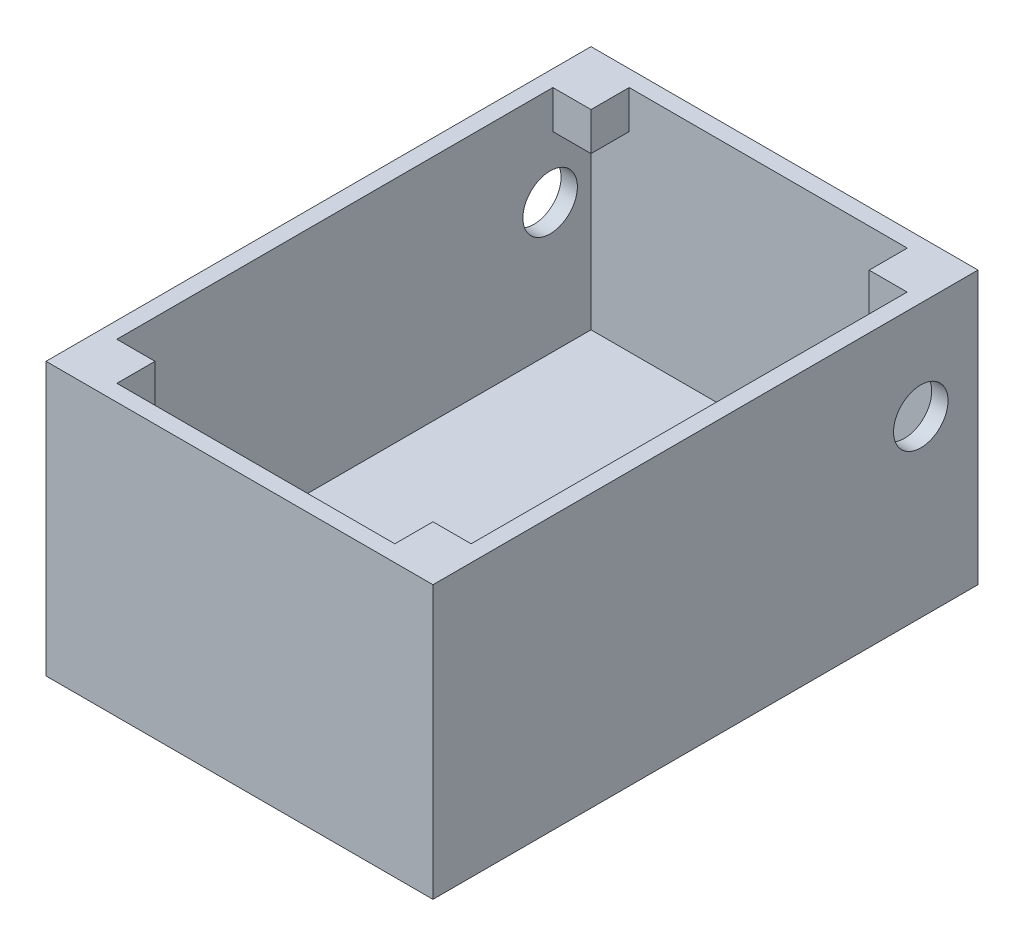
ISO-10303-21;
HEADER;
FILE_DESCRIPTION(('STEP AP214'),'2;1');
FILE_NAME('part.step','',(''),(''),'','','');
FILE_SCHEMA(('AUTOMOTIVE_DESIGN { 1 0 10303 214 1 1 1 1 }'));
ENDSEC;
DATA;
#1=APPLICATION_CONTEXT('core data for automotive mechanical design processes');
#2=APPLICATION_PROTOCOL_DEFINITION('international standard','automotive_design',2000,#1);
#3=PRODUCT_CONTEXT('',#1,'mechanical');
#4=PRODUCT('Part','Part','',(#3));
#5=PRODUCT_RELATED_PRODUCT_CATEGORY('part','',(#4));
#6=PRODUCT_DEFINITION_FORMATION('','',#4);
#7=PRODUCT_DEFINITION_CONTEXT('part definition',#1,'design');
#8=PRODUCT_DEFINITION('design','',#6,#7);
#9=PRODUCT_DEFINITION_SHAPE('','',#8);
#10=(LENGTH_UNIT() NAMED_UNIT(*) SI_UNIT(.MILLI.,.METRE.));
#11=(NAMED_UNIT(*) PLANE_ANGLE_UNIT() SI_UNIT($,.RADIAN.));
#12=(NAMED_UNIT(*) SI_UNIT($,.STERADIAN.) SOLID_ANGLE_UNIT());
#13=UNCERTAINTY_MEASURE_WITH_UNIT(LENGTH_MEASURE(1.E-05),#10,'distance_accuracy_value','');
#14=(GEOMETRIC_REPRESENTATION_CONTEXT(3) GLOBAL_UNCERTAINTY_ASSIGNED_CONTEXT((#13)) GLOBAL_UNIT_ASSIGNED_CONTEXT((#10,
#11,#12)) REPRESENTATION_CONTEXT('',''));
#15=CARTESIAN_POINT('',(0.,0.,0.));
#16=DIRECTION('',(0.,0.,1.));
#17=DIRECTION('',(1.,0.,0.));
#18=AXIS2_PLACEMENT_3D('',#15,#16,#17);
#19=CARTESIAN_POINT('',(-61.6961689538245,3.,-26.5));
#20=DIRECTION('',(-1.,0.,0.));
#21=DIRECTION('',(0.,0.,1.));
#22=AXIS2_PLACEMENT_3D('',#19,#20,#21);
#23=PLANE('',#22);
#24=CARTESIAN_POINT('',(-61.6961689538245,32.,-19.));
#25=DIRECTION('',(-1.,0.,0.));
#26=DIRECTION('',(0.,0.,1.));
#27=AXIS2_PLACEMENT_3D('',#24,#25,#26);
#28=CIRCLE('',#27,5.);
#29=CARTESIAN_POINT('',(-61.6961689538245,32.,-14.));
#30=VERTEX_POINT('',#29);
#31=EDGE_CURVE('E275',#30,#30,#28,.T.);
#32=ORIENTED_EDGE('',*,*,#31,.T.);
#33=EDGE_LOOP('',(#32));
#34=FACE_BOUND('',#33,.T.);
#35=DIRECTION('',(0.,0.,1.));
#36=VECTOR('',#35,1.);
#37=CARTESIAN_POINT('',(-61.6961689538245,50.,-26.5));
#38=LINE('',#37,#36);
#39=CARTESIAN_POINT('',(-61.6961689538245,50.,-19.5));
#40=VERTEX_POINT('',#39);
#41=CARTESIAN_POINT('',(-61.6961689538245,50.,60.5));
#42=VERTEX_POINT('',#41);
#43=EDGE_CURVE('E52',#40,#42,#38,.T.);
#44=ORIENTED_EDGE('',*,*,#43,.T.);
#45=DIRECTION('',(0.,-1.,0.));
#46=VECTOR('',#45,1.);
#47=CARTESIAN_POINT('',(-61.6961689538245,3.,60.5));
#48=LINE('',#47,#46);
#49=CARTESIAN_POINT('',(-61.6961689538245,43.,60.5));
#50=VERTEX_POINT('',#49);
#51=EDGE_CURVE('E47',#42,#50,#48,.T.);
#52=ORIENTED_EDGE('',*,*,#51,.T.);
#53=DIRECTION('',(0.,0.,1.));
#54=VECTOR('',#53,1.);
#55=CARTESIAN_POINT('',(-61.6961689538245,43.,-26.5));
#56=LINE('',#55,#54);
#57=CARTESIAN_POINT('',(-61.6961689538245,43.,67.5));
#58=VERTEX_POINT('',#57);
#59=EDGE_CURVE('E202',#50,#58,#56,.T.);
#60=ORIENTED_EDGE('',*,*,#59,.T.);
#61=DIRECTION('',(0.,1.,0.));
#62=VECTOR('',#61,1.);
#63=CARTESIAN_POINT('',(-61.6961689538245,3.,67.5));
#64=LINE('',#63,#62);
#65=CARTESIAN_POINT('',(-61.6961689538245,3.,67.5));
#66=VERTEX_POINT('',#65);
#67=EDGE_CURVE('E322',#66,#58,#64,.T.);
#68=ORIENTED_EDGE('',*,*,#67,.F.);
#69=DIRECTION('',(0.,0.,1.));
#70=VECTOR('',#69,1.);
#71=CARTESIAN_POINT('',(-61.6961689538245,3.,-26.5));
#72=LINE('',#71,#70);
#73=CARTESIAN_POINT('',(-61.6961689538245,3.,35.1620847651777));
#74=VERTEX_POINT('',#73);
#75=EDGE_CURVE('E313',#74,#66,#72,.T.);
#76=ORIENTED_EDGE('',*,*,#75,.F.);
#77=DIRECTION('',(0.,-1.,0.));
#78=VECTOR('',#77,1.);
#79=CARTESIAN_POINT('',(-61.6961689538245,8.,35.1620847651777));
#80=LINE('',#79,#78);
#81=CARTESIAN_POINT('',(-61.6961689538245,8.,35.1620847651777));
#82=VERTEX_POINT('',#81);
#83=EDGE_CURVE('E301',#82,#74,#80,.T.);
#84=ORIENTED_EDGE('',*,*,#83,.F.);
#85=DIRECTION('',(0.,0.,1.));
#86=VECTOR('',#85,1.);
#87=CARTESIAN_POINT('',(-61.6961689538245,8.,-26.5));
#88=LINE('',#87,#86);
#89=CARTESIAN_POINT('',(-61.6961689538245,8.,-26.5));
#90=VERTEX_POINT('',#89);
#91=EDGE_CURVE('E279',#90,#82,#88,.T.);
#92=ORIENTED_EDGE('',*,*,#91,.F.);
#93=DIRECTION('',(0.,1.,0.));
#94=VECTOR('',#93,1.);
#95=CARTESIAN_POINT('',(-61.6961689538245,3.,-26.5));
#96=LINE('',#95,#94);
#97=CARTESIAN_POINT('',(-61.6961689538245,43.,-26.5));
#98=VERTEX_POINT('',#97);
#99=EDGE_CURVE('E326',#90,#98,#96,.T.);
#100=ORIENTED_EDGE('',*,*,#99,.T.);
#101=DIRECTION('',(0.,0.,-1.));
#102=VECTOR('',#101,1.);
#103=CARTESIAN_POINT('',(-61.6961689538245,43.,-26.5));
#104=LINE('',#103,#102);
#105=CARTESIAN_POINT('',(-61.6961689538245,43.,-19.5));
#106=VERTEX_POINT('',#105);
#107=EDGE_CURVE('E265',#106,#98,#104,.T.);
#108=ORIENTED_EDGE('',*,*,#107,.F.);
#109=DIRECTION('',(0.,1.,0.));
#110=VECTOR('',#109,1.);
#111=CARTESIAN_POINT('',(-61.6961689538245,3.,-19.5));
#112=LINE('',#111,#110);
#113=EDGE_CURVE('E258',#106,#40,#112,.T.);
#114=ORIENTED_EDGE('',*,*,#113,.T.);
#115=EDGE_LOOP('',(#44,#52,#60,#68,#76,#84,#92,#100,#108,#114));
#116=FACE_BOUND('',#115,.T.);
#117=ADVANCED_FACE('F32',(#34,#116),#23,.F.);
#118=CARTESIAN_POINT('',(-61.6961689538245,3.,-26.5));
#119=DIRECTION('',(0.,0.,-1.));
#120=DIRECTION('',(-1.,0.,0.));
#121=AXIS2_PLACEMENT_3D('',#118,#119,#120);
#122=PLANE('',#121);
#123=DIRECTION('',(-1.,0.,0.));
#124=VECTOR('',#123,1.);
#125=CARTESIAN_POINT('',(-61.6961689538245,43.,-26.5));
#126=LINE('',#125,#124);
#127=CARTESIAN_POINT('',(3.30383104617551,43.,-26.5));
#128=VERTEX_POINT('',#127);
#129=CARTESIAN_POINT('',(-3.66743388043886,43.,-26.5));
#130=VERTEX_POINT('',#129);
#131=EDGE_CURVE('E241',#128,#130,#126,.T.);
#132=ORIENTED_EDGE('',*,*,#131,.T.);
#133=DIRECTION('',(0.,1.,0.));
#134=VECTOR('',#133,1.);
#135=CARTESIAN_POINT('',(-3.66743388043886,3.,-26.5));
#136=LINE('',#135,#134);
#137=CARTESIAN_POINT('',(-3.66743388043886,50.,-26.5));
#138=VERTEX_POINT('',#137);
#139=EDGE_CURVE('E243',#130,#138,#136,.T.);
#140=ORIENTED_EDGE('',*,*,#139,.T.);
#141=DIRECTION('',(-1.,0.,0.));
#142=VECTOR('',#141,1.);
#143=CARTESIAN_POINT('',(-61.6961689538245,50.,-26.5));
#144=LINE('',#143,#142);
#145=CARTESIAN_POINT('',(-54.6961689538245,50.,-26.5));
#146=VERTEX_POINT('',#145);
#147=EDGE_CURVE('E319',#138,#146,#144,.T.);
#148=ORIENTED_EDGE('',*,*,#147,.T.);
#149=DIRECTION('',(0.,-1.,0.));
#150=VECTOR('',#149,1.);
#151=CARTESIAN_POINT('',(-54.6961689538245,3.,-26.5));
#152=LINE('',#151,#150);
#153=CARTESIAN_POINT('',(-54.6961689538245,43.,-26.5));
#154=VERTEX_POINT('',#153);
#155=EDGE_CURVE('E260',#146,#154,#152,.T.);
#156=ORIENTED_EDGE('',*,*,#155,.T.);
#157=DIRECTION('',(1.,0.,0.));
#158=VECTOR('',#157,1.);
#159=CARTESIAN_POINT('',(-61.6961689538245,43.,-26.5));
#160=LINE('',#159,#158);
#161=EDGE_CURVE('E262',#98,#154,#160,.T.);
#162=ORIENTED_EDGE('',*,*,#161,.F.);
#163=ORIENTED_EDGE('',*,*,#99,.F.);
#164=DIRECTION('',(-1.,0.,0.));
#165=VECTOR('',#164,1.);
#166=CARTESIAN_POINT('',(-61.6961689538245,8.,-26.5));
#167=LINE('',#166,#165);
#168=CARTESIAN_POINT('',(-10.6961689538245,8.,-26.5));
#169=VERTEX_POINT('',#168);
#170=EDGE_CURVE('E288',#169,#90,#167,.T.);
#171=ORIENTED_EDGE('',*,*,#170,.F.);
#172=DIRECTION('',(0.,-1.,0.));
#173=VECTOR('',#172,1.);
#174=CARTESIAN_POINT('',(-10.6961689538245,8.,-26.5));
#175=LINE('',#174,#173);
#176=CARTESIAN_POINT('',(-10.6961689538245,3.,-26.5));
#177=VERTEX_POINT('',#176);
#178=EDGE_CURVE('E291',#169,#177,#175,.T.);
#179=ORIENTED_EDGE('',*,*,#178,.T.);
#180=DIRECTION('',(-1.,0.,0.));
#181=VECTOR('',#180,1.);
#182=CARTESIAN_POINT('',(-61.6961689538245,3.,-26.5));
#183=LINE('',#182,#181);
#184=CARTESIAN_POINT('',(3.30383104617551,3.,-26.5));
#185=VERTEX_POINT('',#184);
#186=EDGE_CURVE('E311',#185,#177,#183,.T.);
#187=ORIENTED_EDGE('',*,*,#186,.F.);
#188=DIRECTION('',(0.,1.,0.));
#189=VECTOR('',#188,1.);
#190=CARTESIAN_POINT('',(3.30383104617551,3.,-26.5));
#191=LINE('',#190,#189);
#192=EDGE_CURVE('E329',#185,#128,#191,.T.);
#193=ORIENTED_EDGE('',*,*,#192,.T.);
#194=EDGE_LOOP('',(#132,#140,#148,#156,#162,#163,#171,#179,#187,#193));
#195=FACE_BOUND('',#194,.T.);
#196=ADVANCED_FACE('F390',(#195),#122,.F.);
#197=CARTESIAN_POINT('',(0.,3.,0.));
#198=DIRECTION('',(0.,-1.,0.));
#199=DIRECTION('',(0.,0.,-1.));
#200=AXIS2_PLACEMENT_3D('',#197,#198,#199);
#201=PLANE('',#200);
#202=DIRECTION('',(1.,0.,0.));
#203=VECTOR('',#202,1.);
#204=CARTESIAN_POINT('',(-61.6961689538245,3.,35.1620847651777));
#205=LINE('',#204,#203);
#206=CARTESIAN_POINT('',(-10.6961689538245,3.,35.1620847651777));
#207=VERTEX_POINT('',#206);
#208=EDGE_CURVE('E278',#74,#207,#205,.T.);
#209=ORIENTED_EDGE('',*,*,#208,.F.);
#210=ORIENTED_EDGE('',*,*,#75,.T.);
#211=DIRECTION('',(1.,0.,0.));
#212=VECTOR('',#211,1.);
#213=CARTESIAN_POINT('',(-61.6961689538245,3.,67.5));
#214=LINE('',#213,#212);
#215=CARTESIAN_POINT('',(3.30383104617551,3.,67.5));
#216=VERTEX_POINT('',#215);
#217=EDGE_CURVE('E305',#66,#216,#214,.T.);
#218=ORIENTED_EDGE('',*,*,#217,.T.);
#219=DIRECTION('',(0.,0.,-1.));
#220=VECTOR('',#219,1.);
#221=CARTESIAN_POINT('',(3.30383104617551,3.,-26.5));
#222=LINE('',#221,#220);
#223=EDGE_CURVE('E308',#216,#185,#222,.T.);
#224=ORIENTED_EDGE('',*,*,#223,.T.);
#225=ORIENTED_EDGE('',*,*,#186,.T.);
#226=DIRECTION('',(0.,0.,-1.));
#227=VECTOR('',#226,1.);
#228=CARTESIAN_POINT('',(-10.6961689538245,3.,-26.5));
#229=LINE('',#228,#227);
#230=EDGE_CURVE('E283',#207,#177,#229,.T.);
#231=ORIENTED_EDGE('',*,*,#230,.F.);
#232=EDGE_LOOP('',(#209,#210,#218,#224,#225,#231));
#233=FACE_BOUND('',#232,.T.);
#234=ADVANCED_FACE('F421',(#233),#201,.F.);
#235=CARTESIAN_POINT('',(-64.6961689538245,50.,-29.5));
#236=DIRECTION('',(0.,0.,-1.));
#237=DIRECTION('',(-1.,0.,0.));
#238=AXIS2_PLACEMENT_3D('',#235,#236,#237);
#239=PLANE('',#238);
#240=DIRECTION('',(1.,0.,0.));
#241=VECTOR('',#240,1.);
#242=CARTESIAN_POINT('',(-64.6961689538245,50.,-29.5));
#243=LINE('',#242,#241);
#244=CARTESIAN_POINT('',(-64.6961689538245,50.,-29.5));
#245=VERTEX_POINT('',#244);
#246=CARTESIAN_POINT('',(6.30383104617551,50.,-29.5));
#247=VERTEX_POINT('',#246);
#248=EDGE_CURVE('E334',#245,#247,#243,.T.);
#249=ORIENTED_EDGE('',*,*,#248,.T.);
#250=DIRECTION('',(0.,-1.,0.));
#251=VECTOR('',#250,1.);
#252=CARTESIAN_POINT('',(6.30383104617551,50.,-29.5));
#253=LINE('',#252,#251);
#254=CARTESIAN_POINT('',(6.30383104617551,0.,-29.5));
#255=VERTEX_POINT('',#254);
#256=EDGE_CURVE('E344',#247,#255,#253,.T.);
#257=ORIENTED_EDGE('',*,*,#256,.T.);
#258=DIRECTION('',(1.,0.,0.));
#259=VECTOR('',#258,1.);
#260=CARTESIAN_POINT('',(-64.6961689538245,0.,-29.5));
#261=LINE('',#260,#259);
#262=CARTESIAN_POINT('',(-64.6961689538245,0.,-29.5));
#263=VERTEX_POINT('',#262);
#264=EDGE_CURVE('E325',#263,#255,#261,.T.);
#265=ORIENTED_EDGE('',*,*,#264,.F.);
#266=DIRECTION('',(0.,-1.,0.));
#267=VECTOR('',#266,1.);
#268=CARTESIAN_POINT('',(-64.6961689538245,50.,-29.5));
#269=LINE('',#268,#267);
#270=EDGE_CURVE('E355',#245,#263,#269,.T.);
#271=ORIENTED_EDGE('',*,*,#270,.F.);
#272=EDGE_LOOP('',(#249,#257,#265,#271));
#273=FACE_BOUND('',#272,.T.);
#274=ADVANCED_FACE('F34',(#273),#239,.T.);
#275=CARTESIAN_POINT('',(-64.6961689538245,50.,-29.5));
#276=DIRECTION('',(1.,0.,0.));
#277=DIRECTION('',(0.,0.,-1.));
#278=AXIS2_PLACEMENT_3D('',#275,#276,#277);
#279=PLANE('',#278);
#280=DIRECTION('',(0.,-1.,0.));
#281=VECTOR('',#280,1.);
#282=CARTESIAN_POINT('',(-64.6961689538245,50.,70.5));
#283=LINE('',#282,#281);
#284=CARTESIAN_POINT('',(-64.6961689538245,50.,70.5));
#285=VERTEX_POINT('',#284);
#286=CARTESIAN_POINT('',(-64.6961689538245,0.,70.5));
#287=VERTEX_POINT('',#286);
#288=EDGE_CURVE('E358',#285,#287,#283,.T.);
#289=ORIENTED_EDGE('',*,*,#288,.F.);
#290=DIRECTION('',(0.,0.,1.));
#291=VECTOR('',#290,1.);
#292=CARTESIAN_POINT('',(-64.6961689538245,50.,-29.5));
#293=LINE('',#292,#291);
#294=EDGE_CURVE('E342',#245,#285,#293,.T.);
#295=ORIENTED_EDGE('',*,*,#294,.F.);
#296=ORIENTED_EDGE('',*,*,#270,.T.);
#297=DIRECTION('',(0.,0.,1.));
#298=VECTOR('',#297,1.);
#299=CARTESIAN_POINT('',(-64.6961689538245,0.,-29.5));
#300=LINE('',#299,#298);
#301=EDGE_CURVE('E337',#263,#287,#300,.T.);
#302=ORIENTED_EDGE('',*,*,#301,.T.);
#303=EDGE_LOOP('',(#289,#295,#296,#302));
#304=FACE_BOUND('',#303,.T.);
#305=CARTESIAN_POINT('',(-64.6961689538245,32.,-19.));
#306=DIRECTION('',(1.,0.,0.));
#307=DIRECTION('',(0.,0.,-1.));
#308=AXIS2_PLACEMENT_3D('',#305,#306,#307);
#309=CIRCLE('',#308,5.);
#310=CARTESIAN_POINT('',(-64.6961689538245,32.,-24.));
#311=VERTEX_POINT('',#310);
#312=EDGE_CURVE('E271',#311,#311,#309,.T.);
#313=ORIENTED_EDGE('',*,*,#312,.T.);
#314=EDGE_LOOP('',(#313));
#315=FACE_BOUND('',#314,.T.);
#316=ADVANCED_FACE('F428',(#304,#315),#279,.F.);
#317=CARTESIAN_POINT('',(-64.6961689538245,50.,70.5));
#318=DIRECTION('',(0.,0.,-1.));
#319=DIRECTION('',(-1.,0.,0.));
#320=AXIS2_PLACEMENT_3D('',#317,#318,#319);
#321=PLANE('',#320);
#322=DIRECTION('',(0.,-1.,0.));
#323=VECTOR('',#322,1.);
#324=CARTESIAN_POINT('',(6.30383104617551,50.,70.5));
#325=LINE('',#324,#323);
#326=CARTESIAN_POINT('',(6.30383104617551,50.,70.5));
#327=VERTEX_POINT('',#326);
#328=CARTESIAN_POINT('',(6.30383104617551,0.,70.5));
#329=VERTEX_POINT('',#328);
#330=EDGE_CURVE('E360',#327,#329,#325,.T.);
#331=ORIENTED_EDGE('',*,*,#330,.F.);
#332=DIRECTION('',(1.,0.,0.));
#333=VECTOR('',#332,1.);
#334=CARTESIAN_POINT('',(-64.6961689538245,50.,70.5));
#335=LINE('',#334,#333);
#336=EDGE_CURVE('E340',#285,#327,#335,.T.);
#337=ORIENTED_EDGE('',*,*,#336,.F.);
#338=ORIENTED_EDGE('',*,*,#288,.T.);
#339=DIRECTION('',(1.,0.,0.));
#340=VECTOR('',#339,1.);
#341=CARTESIAN_POINT('',(-64.6961689538245,0.,70.5));
#342=LINE('',#341,#340);
#343=EDGE_CURVE('E350',#287,#329,#342,.T.);
#344=ORIENTED_EDGE('',*,*,#343,.T.);
#345=EDGE_LOOP('',(#331,#337,#338,#344));
#346=FACE_BOUND('',#345,.T.);
#347=ADVANCED_FACE('F452',(#346),#321,.F.);
#348=CARTESIAN_POINT('',(6.30383104617551,50.,-29.5));
#349=DIRECTION('',(1.,0.,0.));
#350=DIRECTION('',(0.,0.,-1.));
#351=AXIS2_PLACEMENT_3D('',#348,#349,#350);
#352=PLANE('',#351);
#353=DIRECTION('',(0.,0.,1.));
#354=VECTOR('',#353,1.);
#355=CARTESIAN_POINT('',(6.30383104617551,50.,-29.5));
#356=LINE('',#355,#354);
#357=EDGE_CURVE('E336',#247,#327,#356,.T.);
#358=ORIENTED_EDGE('',*,*,#357,.T.);
#359=ORIENTED_EDGE('',*,*,#330,.T.);
#360=DIRECTION('',(0.,0.,1.));
#361=VECTOR('',#360,1.);
#362=CARTESIAN_POINT('',(6.30383104617551,0.,-29.5));
#363=LINE('',#362,#361);
#364=EDGE_CURVE('E347',#255,#329,#363,.T.);
#365=ORIENTED_EDGE('',*,*,#364,.F.);
#366=ORIENTED_EDGE('',*,*,#256,.F.);
#367=EDGE_LOOP('',(#358,#359,#365,#366));
#368=FACE_BOUND('',#367,.T.);
#369=CARTESIAN_POINT('',(6.30383104617552,32.,-19.));
#370=DIRECTION('',(1.,0.,0.));
#371=DIRECTION('',(0.,0.,-1.));
#372=AXIS2_PLACEMENT_3D('',#369,#370,#371);
#373=CIRCLE('',#372,5.);
#374=CARTESIAN_POINT('',(6.30383104617552,32.,-24.));
#375=VERTEX_POINT('',#374);
#376=EDGE_CURVE('E268',#375,#375,#373,.T.);
#377=ORIENTED_EDGE('',*,*,#376,.F.);
#378=EDGE_LOOP('',(#377));
#379=FACE_BOUND('',#378,.T.);
#380=ADVANCED_FACE('F446',(#368,#379),#352,.T.);
#381=CARTESIAN_POINT('',(0.,50.,0.));
#382=DIRECTION('',(0.,-1.,0.));
#383=DIRECTION('',(0.,0.,-1.));
#384=AXIS2_PLACEMENT_3D('',#381,#382,#383);
#385=PLANE('',#384);
#386=DIRECTION('',(-1.,0.,0.));
#387=VECTOR('',#386,1.);
#388=CARTESIAN_POINT('',(-64.6961689538245,50.,60.5));
#389=LINE('',#388,#387);
#390=CARTESIAN_POINT('',(-54.6961689538245,50.,60.5));
#391=VERTEX_POINT('',#390);
#392=EDGE_CURVE('E196',#391,#42,#389,.T.);
#393=ORIENTED_EDGE('',*,*,#392,.T.);
#394=ORIENTED_EDGE('',*,*,#43,.F.);
#395=DIRECTION('',(1.,0.,0.));
#396=VECTOR('',#395,1.);
#397=CARTESIAN_POINT('',(-64.6961689538245,50.,-19.5));
#398=LINE('',#397,#396);
#399=CARTESIAN_POINT('',(-54.6961689538245,50.,-19.5));
#400=VERTEX_POINT('',#399);
#401=EDGE_CURVE('E245',#40,#400,#398,.T.);
#402=ORIENTED_EDGE('',*,*,#401,.T.);
#403=DIRECTION('',(0.,0.,-1.));
#404=VECTOR('',#403,1.);
#405=CARTESIAN_POINT('',(-54.6961689538245,50.,-29.5));
#406=LINE('',#405,#404);
#407=EDGE_CURVE('E249',#400,#146,#406,.T.);
#408=ORIENTED_EDGE('',*,*,#407,.T.);
#409=ORIENTED_EDGE('',*,*,#147,.F.);
#410=DIRECTION('',(0.,0.,1.));
#411=VECTOR('',#410,1.);
#412=CARTESIAN_POINT('',(-3.66743388043886,50.,-29.5));
#413=LINE('',#412,#411);
#414=CARTESIAN_POINT('',(-3.66743388043886,50.,-19.5));
#415=VERTEX_POINT('',#414);
#416=EDGE_CURVE('E228',#138,#415,#413,.T.);
#417=ORIENTED_EDGE('',*,*,#416,.T.);
#418=DIRECTION('',(1.,0.,0.));
#419=VECTOR('',#418,1.);
#420=CARTESIAN_POINT('',(6.30383104617551,50.,-19.5));
#421=LINE('',#420,#419);
#422=CARTESIAN_POINT('',(3.30383104617551,50.,-19.5));
#423=VERTEX_POINT('',#422);
#424=EDGE_CURVE('E232',#415,#423,#421,.T.);
#425=ORIENTED_EDGE('',*,*,#424,.T.);
#426=DIRECTION('',(0.,0.,-1.));
#427=VECTOR('',#426,1.);
#428=CARTESIAN_POINT('',(3.30383104617551,50.,-26.5));
#429=LINE('',#428,#427);
#430=CARTESIAN_POINT('',(3.30383104617551,50.,60.5));
#431=VERTEX_POINT('',#430);
#432=EDGE_CURVE('E317',#431,#423,#429,.T.);
#433=ORIENTED_EDGE('',*,*,#432,.F.);
#434=DIRECTION('',(-1.,0.,0.));
#435=VECTOR('',#434,1.);
#436=CARTESIAN_POINT('',(6.30383104617551,50.,60.5));
#437=LINE('',#436,#435);
#438=CARTESIAN_POINT('',(-3.69616895382449,50.,60.5));
#439=VERTEX_POINT('',#438);
#440=EDGE_CURVE('E212',#431,#439,#437,.T.);
#441=ORIENTED_EDGE('',*,*,#440,.T.);
#442=DIRECTION('',(0.,0.,1.));
#443=VECTOR('',#442,1.);
#444=CARTESIAN_POINT('',(-3.69616895382449,50.,70.5));
#445=LINE('',#444,#443);
#446=CARTESIAN_POINT('',(-3.69616895382449,50.,67.5));
#447=VERTEX_POINT('',#446);
#448=EDGE_CURVE('E216',#439,#447,#445,.T.);
#449=ORIENTED_EDGE('',*,*,#448,.T.);
#450=DIRECTION('',(1.,0.,0.));
#451=VECTOR('',#450,1.);
#452=CARTESIAN_POINT('',(-61.6961689538245,50.,67.5));
#453=LINE('',#452,#451);
#454=CARTESIAN_POINT('',(-54.6961689538245,50.,67.5));
#455=VERTEX_POINT('',#454);
#456=EDGE_CURVE('E304',#455,#447,#453,.T.);
#457=ORIENTED_EDGE('',*,*,#456,.F.);
#458=DIRECTION('',(0.,0.,-1.));
#459=VECTOR('',#458,1.);
#460=CARTESIAN_POINT('',(-54.6961689538245,50.,70.5));
#461=LINE('',#460,#459);
#462=EDGE_CURVE('E207',#455,#391,#461,.T.);
#463=ORIENTED_EDGE('',*,*,#462,.T.);
#464=EDGE_LOOP('',(#393,#394,#402,#408,#409,#417,#425,#433,#441,#449,#457,#463));
#465=FACE_BOUND('',#464,.T.);
#466=ORIENTED_EDGE('',*,*,#294,.T.);
#467=ORIENTED_EDGE('',*,*,#336,.T.);
#468=ORIENTED_EDGE('',*,*,#357,.F.);
#469=ORIENTED_EDGE('',*,*,#248,.F.);
#470=EDGE_LOOP('',(#466,#467,#468,#469));
#471=FACE_BOUND('',#470,.T.);
#472=ADVANCED_FACE('F405',(#465,#471),#385,.F.);
#473=CARTESIAN_POINT('',(0.,0.,0.));
#474=DIRECTION('',(0.,-1.,0.));
#475=DIRECTION('',(0.,0.,-1.));
#476=AXIS2_PLACEMENT_3D('',#473,#474,#475);
#477=PLANE('',#476);
#478=ORIENTED_EDGE('',*,*,#264,.T.);
#479=ORIENTED_EDGE('',*,*,#364,.T.);
#480=ORIENTED_EDGE('',*,*,#343,.F.);
#481=ORIENTED_EDGE('',*,*,#301,.F.);
#482=EDGE_LOOP('',(#478,#479,#480,#481));
#483=FACE_BOUND('',#482,.T.);
#484=ADVANCED_FACE('F443',(#483),#477,.T.);
#485=CARTESIAN_POINT('',(-61.6961689538245,3.,67.5));
#486=DIRECTION('',(0.,0.,1.));
#487=DIRECTION('',(1.,0.,0.));
#488=AXIS2_PLACEMENT_3D('',#485,#486,#487);
#489=PLANE('',#488);
#490=DIRECTION('',(1.,0.,0.));
#491=VECTOR('',#490,1.);
#492=CARTESIAN_POINT('',(-61.6961689538245,43.,67.5));
#493=LINE('',#492,#491);
#494=CARTESIAN_POINT('',(-54.6961689538245,43.,67.5));
#495=VERTEX_POINT('',#494);
#496=EDGE_CURVE('E40',#58,#495,#493,.T.);
#497=ORIENTED_EDGE('',*,*,#496,.T.);
#498=DIRECTION('',(0.,1.,0.));
#499=VECTOR('',#498,1.);
#500=CARTESIAN_POINT('',(-54.6961689538245,3.,67.5));
#501=LINE('',#500,#499);
#502=EDGE_CURVE('E11',#495,#455,#501,.T.);
#503=ORIENTED_EDGE('',*,*,#502,.T.);
#504=ORIENTED_EDGE('',*,*,#456,.T.);
#505=DIRECTION('',(0.,-1.,0.));
#506=VECTOR('',#505,1.);
#507=CARTESIAN_POINT('',(-3.69616895382449,3.,67.5));
#508=LINE('',#507,#506);
#509=CARTESIAN_POINT('',(-3.69616895382449,43.,67.5));
#510=VERTEX_POINT('',#509);
#511=EDGE_CURVE('E374',#447,#510,#508,.T.);
#512=ORIENTED_EDGE('',*,*,#511,.T.);
#513=DIRECTION('',(-1.,0.,0.));
#514=VECTOR('',#513,1.);
#515=CARTESIAN_POINT('',(-61.6961689538245,43.,67.5));
#516=LINE('',#515,#514);
#517=CARTESIAN_POINT('',(3.30383104617551,43.,67.5));
#518=VERTEX_POINT('',#517);
#519=EDGE_CURVE('E225',#518,#510,#516,.T.);
#520=ORIENTED_EDGE('',*,*,#519,.F.);
#521=DIRECTION('',(0.,1.,0.));
#522=VECTOR('',#521,1.);
#523=CARTESIAN_POINT('',(3.30383104617551,3.,67.5));
#524=LINE('',#523,#522);
#525=EDGE_CURVE('E315',#216,#518,#524,.T.);
#526=ORIENTED_EDGE('',*,*,#525,.F.);
#527=ORIENTED_EDGE('',*,*,#217,.F.);
#528=ORIENTED_EDGE('',*,*,#67,.T.);
#529=EDGE_LOOP('',(#497,#503,#504,#512,#520,#526,#527,#528));
#530=FACE_BOUND('',#529,.T.);
#531=ADVANCED_FACE('F376',(#530),#489,.F.);
#532=CARTESIAN_POINT('',(3.30383104617551,3.,-26.5));
#533=DIRECTION('',(1.,0.,0.));
#534=DIRECTION('',(0.,0.,-1.));
#535=AXIS2_PLACEMENT_3D('',#532,#533,#534);
#536=PLANE('',#535);
#537=CARTESIAN_POINT('',(3.30383104617551,32.,-19.));
#538=DIRECTION('',(1.,0.,0.));
#539=DIRECTION('',(0.,0.,-1.));
#540=AXIS2_PLACEMENT_3D('',#537,#538,#539);
#541=CIRCLE('',#540,5.);
#542=CARTESIAN_POINT('',(3.30383104617551,32.,-24.));
#543=VERTEX_POINT('',#542);
#544=EDGE_CURVE('E274',#543,#543,#541,.T.);
#545=ORIENTED_EDGE('',*,*,#544,.T.);
#546=EDGE_LOOP('',(#545));
#547=FACE_BOUND('',#546,.T.);
#548=DIRECTION('',(0.,0.,1.));
#549=VECTOR('',#548,1.);
#550=CARTESIAN_POINT('',(3.30383104617551,43.,-26.5));
#551=LINE('',#550,#549);
#552=CARTESIAN_POINT('',(3.30383104617551,43.,60.5));
#553=VERTEX_POINT('',#552);
#554=EDGE_CURVE('E368',#553,#518,#551,.T.);
#555=ORIENTED_EDGE('',*,*,#554,.F.);
#556=DIRECTION('',(0.,1.,0.));
#557=VECTOR('',#556,1.);
#558=CARTESIAN_POINT('',(3.30383104617551,3.,60.5));
#559=LINE('',#558,#557);
#560=EDGE_CURVE('E371',#553,#431,#559,.T.);
#561=ORIENTED_EDGE('',*,*,#560,.T.);
#562=ORIENTED_EDGE('',*,*,#432,.T.);
#563=DIRECTION('',(0.,-1.,0.));
#564=VECTOR('',#563,1.);
#565=CARTESIAN_POINT('',(3.30383104617551,3.,-19.5));
#566=LINE('',#565,#564);
#567=CARTESIAN_POINT('',(3.30383104617551,43.,-19.5));
#568=VERTEX_POINT('',#567);
#569=EDGE_CURVE('E366',#423,#568,#566,.T.);
#570=ORIENTED_EDGE('',*,*,#569,.T.);
#571=DIRECTION('',(0.,0.,-1.));
#572=VECTOR('',#571,1.);
#573=CARTESIAN_POINT('',(3.30383104617551,43.,-26.5));
#574=LINE('',#573,#572);
#575=EDGE_CURVE('E357',#568,#128,#574,.T.);
#576=ORIENTED_EDGE('',*,*,#575,.T.);
#577=ORIENTED_EDGE('',*,*,#192,.F.);
#578=ORIENTED_EDGE('',*,*,#223,.F.);
#579=ORIENTED_EDGE('',*,*,#525,.T.);
#580=EDGE_LOOP('',(#555,#561,#562,#570,#576,#577,#578,#579));
#581=FACE_BOUND('',#580,.T.);
#582=ADVANCED_FACE('F418',(#547,#581),#536,.F.);
#583=CARTESIAN_POINT('',(-61.6961689538245,8.,35.1620847651777));
#584=DIRECTION('',(0.,0.,-1.));
#585=DIRECTION('',(-1.,0.,0.));
#586=AXIS2_PLACEMENT_3D('',#583,#584,#585);
#587=PLANE('',#586);
#588=ORIENTED_EDGE('',*,*,#208,.T.);
#589=DIRECTION('',(0.,-1.,0.));
#590=VECTOR('',#589,1.);
#591=CARTESIAN_POINT('',(-10.6961689538245,8.,35.1620847651777));
#592=LINE('',#591,#590);
#593=CARTESIAN_POINT('',(-10.6961689538245,8.,35.1620847651777));
#594=VERTEX_POINT('',#593);
#595=EDGE_CURVE('E298',#594,#207,#592,.T.);
#596=ORIENTED_EDGE('',*,*,#595,.F.);
#597=DIRECTION('',(1.,0.,0.));
#598=VECTOR('',#597,1.);
#599=CARTESIAN_POINT('',(-61.6961689538245,8.,35.1620847651777));
#600=LINE('',#599,#598);
#601=EDGE_CURVE('E282',#82,#594,#600,.T.);
#602=ORIENTED_EDGE('',*,*,#601,.F.);
#603=ORIENTED_EDGE('',*,*,#83,.T.);
#604=EDGE_LOOP('',(#588,#596,#602,#603));
#605=FACE_BOUND('',#604,.T.);
#606=ADVANCED_FACE('F383',(#605),#587,.F.);
#607=CARTESIAN_POINT('',(-10.6961689538245,8.,-26.5));
#608=DIRECTION('',(-1.,0.,0.));
#609=DIRECTION('',(0.,0.,1.));
#610=AXIS2_PLACEMENT_3D('',#607,#608,#609);
#611=PLANE('',#610);
#612=ORIENTED_EDGE('',*,*,#230,.T.);
#613=ORIENTED_EDGE('',*,*,#178,.F.);
#614=DIRECTION('',(0.,0.,-1.));
#615=VECTOR('',#614,1.);
#616=CARTESIAN_POINT('',(-10.6961689538245,8.,-26.5));
#617=LINE('',#616,#615);
#618=EDGE_CURVE('E285',#594,#169,#617,.T.);
#619=ORIENTED_EDGE('',*,*,#618,.F.);
#620=ORIENTED_EDGE('',*,*,#595,.T.);
#621=EDGE_LOOP('',(#612,#613,#619,#620));
#622=FACE_BOUND('',#621,.T.);
#623=ADVANCED_FACE('F477',(#622),#611,.F.);
#624=CARTESIAN_POINT('',(0.,8.,0.));
#625=DIRECTION('',(0.,1.,0.));
#626=DIRECTION('',(0.,0.,1.));
#627=AXIS2_PLACEMENT_3D('',#624,#625,#626);
#628=PLANE('',#627);
#629=ORIENTED_EDGE('',*,*,#91,.T.);
#630=ORIENTED_EDGE('',*,*,#601,.T.);
#631=ORIENTED_EDGE('',*,*,#618,.T.);
#632=ORIENTED_EDGE('',*,*,#170,.T.);
#633=EDGE_LOOP('',(#629,#630,#631,#632));
#634=FACE_BOUND('',#633,.T.);
#635=ADVANCED_FACE('F387',(#634),#628,.T.);
#636=CARTESIAN_POINT('',(-64.6961689538245,32.,-19.));
#637=DIRECTION('',(1.,0.,0.));
#638=DIRECTION('',(0.,0.,-1.));
#639=AXIS2_PLACEMENT_3D('',#636,#637,#638);
#640=CYLINDRICAL_SURFACE('',#639,5.);
#641=ORIENTED_EDGE('',*,*,#376,.T.);
#642=EDGE_LOOP('',(#641));
#643=FACE_BOUND('',#642,.T.);
#644=ORIENTED_EDGE('',*,*,#544,.F.);
#645=EDGE_LOOP('',(#644));
#646=FACE_BOUND('',#645,.T.);
#647=ADVANCED_FACE('F466',(#643,#646),#640,.F.);
#648=ORIENTED_EDGE('',*,*,#312,.F.);
#649=EDGE_LOOP('',(#648));
#650=FACE_BOUND('',#649,.T.);
#651=ORIENTED_EDGE('',*,*,#31,.F.);
#652=EDGE_LOOP('',(#651));
#653=FACE_BOUND('',#652,.T.);
#654=ADVANCED_FACE('F469',(#650,#653),#640,.F.);
#655=CARTESIAN_POINT('',(0.,43.,0.));
#656=DIRECTION('',(0.,1.,0.));
#657=DIRECTION('',(0.,0.,1.));
#658=AXIS2_PLACEMENT_3D('',#655,#656,#657);
#659=PLANE('',#658);
#660=DIRECTION('',(1.,0.,0.));
#661=VECTOR('',#660,1.);
#662=CARTESIAN_POINT('',(-64.6961689538245,43.,-19.5));
#663=LINE('',#662,#661);
#664=CARTESIAN_POINT('',(-54.6961689538245,43.,-19.5));
#665=VERTEX_POINT('',#664);
#666=EDGE_CURVE('E246',#106,#665,#663,.T.);
#667=ORIENTED_EDGE('',*,*,#666,.F.);
#668=ORIENTED_EDGE('',*,*,#107,.T.);
#669=ORIENTED_EDGE('',*,*,#161,.T.);
#670=DIRECTION('',(0.,0.,-1.));
#671=VECTOR('',#670,1.);
#672=CARTESIAN_POINT('',(-54.6961689538245,43.,-29.5));
#673=LINE('',#672,#671);
#674=EDGE_CURVE('E248',#665,#154,#673,.T.);
#675=ORIENTED_EDGE('',*,*,#674,.F.);
#676=EDGE_LOOP('',(#667,#668,#669,#675));
#677=FACE_BOUND('',#676,.T.);
#678=ADVANCED_FACE('F395',(#677),#659,.F.);
#679=CARTESIAN_POINT('',(-54.6961689538245,43.,-29.5));
#680=DIRECTION('',(1.,0.,0.));
#681=DIRECTION('',(0.,0.,-1.));
#682=AXIS2_PLACEMENT_3D('',#679,#680,#681);
#683=PLANE('',#682);
#684=ORIENTED_EDGE('',*,*,#155,.F.);
#685=ORIENTED_EDGE('',*,*,#407,.F.);
#686=DIRECTION('',(0.,1.,0.));
#687=VECTOR('',#686,1.);
#688=CARTESIAN_POINT('',(-54.6961689538245,43.,-19.5));
#689=LINE('',#688,#687);
#690=EDGE_CURVE('E252',#665,#400,#689,.T.);
#691=ORIENTED_EDGE('',*,*,#690,.F.);
#692=ORIENTED_EDGE('',*,*,#674,.T.);
#693=EDGE_LOOP('',(#684,#685,#691,#692));
#694=FACE_BOUND('',#693,.T.);
#695=ADVANCED_FACE('F398',(#694),#683,.T.);
#696=CARTESIAN_POINT('',(-64.6961689538245,43.,-19.5));
#697=DIRECTION('',(0.,0.,1.));
#698=DIRECTION('',(1.,0.,0.));
#699=AXIS2_PLACEMENT_3D('',#696,#697,#698);
#700=PLANE('',#699);
#701=ORIENTED_EDGE('',*,*,#113,.F.);
#702=ORIENTED_EDGE('',*,*,#666,.T.);
#703=ORIENTED_EDGE('',*,*,#690,.T.);
#704=ORIENTED_EDGE('',*,*,#401,.F.);
#705=EDGE_LOOP('',(#701,#702,#703,#704));
#706=FACE_BOUND('',#705,.T.);
#707=ADVANCED_FACE('F403',(#706),#700,.T.);
#708=CARTESIAN_POINT('',(-3.66743388043886,43.,-29.5));
#709=DIRECTION('',(-1.,0.,0.));
#710=DIRECTION('',(0.,0.,1.));
#711=AXIS2_PLACEMENT_3D('',#708,#709,#710);
#712=PLANE('',#711);
#713=ORIENTED_EDGE('',*,*,#139,.F.);
#714=DIRECTION('',(0.,0.,1.));
#715=VECTOR('',#714,1.);
#716=CARTESIAN_POINT('',(-3.66743388043886,43.,-29.5));
#717=LINE('',#716,#715);
#718=CARTESIAN_POINT('',(-3.66743388043886,43.,-19.5));
#719=VERTEX_POINT('',#718);
#720=EDGE_CURVE('E229',#130,#719,#717,.T.);
#721=ORIENTED_EDGE('',*,*,#720,.T.);
#722=DIRECTION('',(0.,1.,0.));
#723=VECTOR('',#722,1.);
#724=CARTESIAN_POINT('',(-3.66743388043886,43.,-19.5));
#725=LINE('',#724,#723);
#726=EDGE_CURVE('E235',#719,#415,#725,.T.);
#727=ORIENTED_EDGE('',*,*,#726,.T.);
#728=ORIENTED_EDGE('',*,*,#416,.F.);
#729=EDGE_LOOP('',(#713,#721,#727,#728));
#730=FACE_BOUND('',#729,.T.);
#731=ADVANCED_FACE('F584',(#730),#712,.T.);
#732=CARTESIAN_POINT('',(6.30383104617551,43.,-19.5));
#733=DIRECTION('',(0.,0.,1.));
#734=DIRECTION('',(1.,0.,0.));
#735=AXIS2_PLACEMENT_3D('',#732,#733,#734);
#736=PLANE('',#735);
#737=ORIENTED_EDGE('',*,*,#569,.F.);
#738=ORIENTED_EDGE('',*,*,#424,.F.);
#739=ORIENTED_EDGE('',*,*,#726,.F.);
#740=DIRECTION('',(1.,0.,0.));
#741=VECTOR('',#740,1.);
#742=CARTESIAN_POINT('',(6.30383104617551,43.,-19.5));
#743=LINE('',#742,#741);
#744=EDGE_CURVE('E231',#719,#568,#743,.T.);
#745=ORIENTED_EDGE('',*,*,#744,.T.);
#746=EDGE_LOOP('',(#737,#738,#739,#745));
#747=FACE_BOUND('',#746,.T.);
#748=ADVANCED_FACE('F592',(#747),#736,.T.);
#749=CARTESIAN_POINT('',(0.,43.,0.));
#750=DIRECTION('',(0.,-1.,0.));
#751=DIRECTION('',(0.,0.,-1.));
#752=AXIS2_PLACEMENT_3D('',#749,#750,#751);
#753=PLANE('',#752);
#754=ORIENTED_EDGE('',*,*,#131,.F.);
#755=ORIENTED_EDGE('',*,*,#575,.F.);
#756=ORIENTED_EDGE('',*,*,#744,.F.);
#757=ORIENTED_EDGE('',*,*,#720,.F.);
#758=EDGE_LOOP('',(#754,#755,#756,#757));
#759=FACE_BOUND('',#758,.T.);
#760=ADVANCED_FACE('F602',(#759),#753,.T.);
#761=CARTESIAN_POINT('',(-3.69616895382449,43.,70.5));
#762=DIRECTION('',(-1.,0.,0.));
#763=DIRECTION('',(0.,0.,1.));
#764=AXIS2_PLACEMENT_3D('',#761,#762,#763);
#765=PLANE('',#764);
#766=ORIENTED_EDGE('',*,*,#511,.F.);
#767=ORIENTED_EDGE('',*,*,#448,.F.);
#768=DIRECTION('',(0.,1.,0.));
#769=VECTOR('',#768,1.);
#770=CARTESIAN_POINT('',(-3.69616895382449,43.,60.5));
#771=LINE('',#770,#769);
#772=CARTESIAN_POINT('',(-3.69616895382449,43.,60.5));
#773=VERTEX_POINT('',#772);
#774=EDGE_CURVE('E219',#773,#439,#771,.T.);
#775=ORIENTED_EDGE('',*,*,#774,.F.);
#776=DIRECTION('',(0.,0.,1.));
#777=VECTOR('',#776,1.);
#778=CARTESIAN_POINT('',(-3.69616895382449,43.,70.5));
#779=LINE('',#778,#777);
#780=EDGE_CURVE('E215',#773,#510,#779,.T.);
#781=ORIENTED_EDGE('',*,*,#780,.T.);
#782=EDGE_LOOP('',(#766,#767,#775,#781));
#783=FACE_BOUND('',#782,.T.);
#784=ADVANCED_FACE('F410',(#783),#765,.T.);
#785=CARTESIAN_POINT('',(6.30383104617551,43.,60.5));
#786=DIRECTION('',(0.,0.,-1.));
#787=DIRECTION('',(-1.,0.,0.));
#788=AXIS2_PLACEMENT_3D('',#785,#786,#787);
#789=PLANE('',#788);
#790=ORIENTED_EDGE('',*,*,#560,.F.);
#791=DIRECTION('',(-1.,0.,0.));
#792=VECTOR('',#791,1.);
#793=CARTESIAN_POINT('',(6.30383104617551,43.,60.5));
#794=LINE('',#793,#792);
#795=EDGE_CURVE('E213',#553,#773,#794,.T.);
#796=ORIENTED_EDGE('',*,*,#795,.T.);
#797=ORIENTED_EDGE('',*,*,#774,.T.);
#798=ORIENTED_EDGE('',*,*,#440,.F.);
#799=EDGE_LOOP('',(#790,#796,#797,#798));
#800=FACE_BOUND('',#799,.T.);
#801=ADVANCED_FACE('F621',(#800),#789,.T.);
#802=CARTESIAN_POINT('',(0.,43.,0.));
#803=DIRECTION('',(0.,1.,0.));
#804=DIRECTION('',(0.,0.,1.));
#805=AXIS2_PLACEMENT_3D('',#802,#803,#804);
#806=PLANE('',#805);
#807=ORIENTED_EDGE('',*,*,#554,.T.);
#808=ORIENTED_EDGE('',*,*,#519,.T.);
#809=ORIENTED_EDGE('',*,*,#780,.F.);
#810=ORIENTED_EDGE('',*,*,#795,.F.);
#811=EDGE_LOOP('',(#807,#808,#809,#810));
#812=FACE_BOUND('',#811,.T.);
#813=ADVANCED_FACE('F415',(#812),#806,.F.);
#814=CARTESIAN_POINT('',(-64.6961689538245,43.,60.5));
#815=DIRECTION('',(0.,0.,-1.));
#816=DIRECTION('',(-1.,0.,0.));
#817=AXIS2_PLACEMENT_3D('',#814,#815,#816);
#818=PLANE('',#817);
#819=ORIENTED_EDGE('',*,*,#51,.F.);
#820=ORIENTED_EDGE('',*,*,#392,.F.);
#821=DIRECTION('',(0.,1.,0.));
#822=VECTOR('',#821,1.);
#823=CARTESIAN_POINT('',(-54.6961689538245,43.,60.5));
#824=LINE('',#823,#822);
#825=CARTESIAN_POINT('',(-54.6961689538245,43.,60.5));
#826=VERTEX_POINT('',#825);
#827=EDGE_CURVE('E190',#826,#391,#824,.T.);
#828=ORIENTED_EDGE('',*,*,#827,.F.);
#829=DIRECTION('',(-1.,0.,0.));
#830=VECTOR('',#829,1.);
#831=CARTESIAN_POINT('',(-64.6961689538245,43.,60.5));
#832=LINE('',#831,#830);
#833=EDGE_CURVE('E195',#826,#50,#832,.T.);
#834=ORIENTED_EDGE('',*,*,#833,.T.);
#835=EDGE_LOOP('',(#819,#820,#828,#834));
#836=FACE_BOUND('',#835,.T.);
#837=ADVANCED_FACE('F200',(#836),#818,.T.);
#838=CARTESIAN_POINT('',(-54.6961689538245,43.,70.5));
#839=DIRECTION('',(1.,0.,0.));
#840=DIRECTION('',(0.,0.,-1.));
#841=AXIS2_PLACEMENT_3D('',#838,#839,#840);
#842=PLANE('',#841);
#843=ORIENTED_EDGE('',*,*,#502,.F.);
#844=DIRECTION('',(0.,0.,-1.));
#845=VECTOR('',#844,1.);
#846=CARTESIAN_POINT('',(-54.6961689538245,43.,70.5));
#847=LINE('',#846,#845);
#848=EDGE_CURVE('E186',#495,#826,#847,.T.);
#849=ORIENTED_EDGE('',*,*,#848,.T.);
#850=ORIENTED_EDGE('',*,*,#827,.T.);
#851=ORIENTED_EDGE('',*,*,#462,.F.);
#852=EDGE_LOOP('',(#843,#849,#850,#851));
#853=FACE_BOUND('',#852,.T.);
#854=ADVANCED_FACE('F188',(#853),#842,.T.);
#855=CARTESIAN_POINT('',(0.,43.,0.));
#856=DIRECTION('',(0.,-1.,0.));
#857=DIRECTION('',(0.,0.,-1.));
#858=AXIS2_PLACEMENT_3D('',#855,#856,#857);
#859=PLANE('',#858);
#860=ORIENTED_EDGE('',*,*,#59,.F.);
#861=ORIENTED_EDGE('',*,*,#833,.F.);
#862=ORIENTED_EDGE('',*,*,#848,.F.);
#863=ORIENTED_EDGE('',*,*,#496,.F.);
#864=EDGE_LOOP('',(#860,#861,#862,#863));
#865=FACE_BOUND('',#864,.T.);
#866=ADVANCED_FACE('F204',(#865),#859,.T.);
#867=CLOSED_SHELL('',(#117,#196,#234,#274,#316,#347,#380,#472,#484,#531,#582,#606,#623,#635,
#647,#654,#678,#695,#707,#731,#748,#760,#784,#801,#813,#837,#854,#866));
#868=MANIFOLD_SOLID_BREP('B2',#867);
#869=ADVANCED_BREP_SHAPE_REPRESENTATION('',(#18,#868),#14);
#870=SHAPE_DEFINITION_REPRESENTATION(#9,#869);
ENDSEC;
END-ISO-10303-21;
